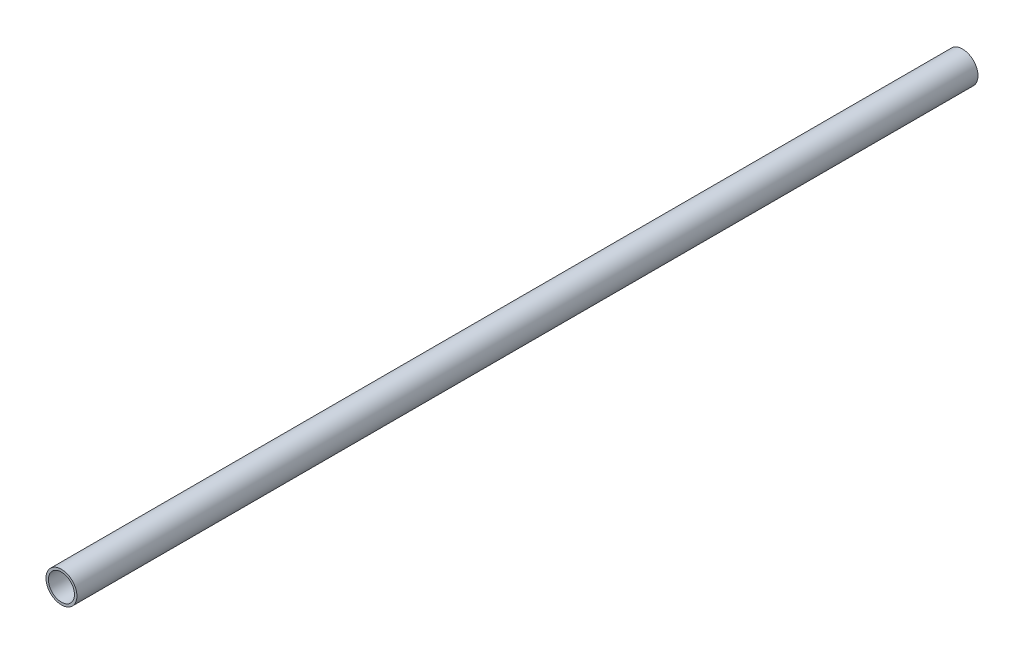
ISO-10303-21;
HEADER;
FILE_DESCRIPTION(('STEP AP214'),'2;1');
FILE_NAME('part.step','',(''),(''),'','','');
FILE_SCHEMA(('AUTOMOTIVE_DESIGN { 1 0 10303 214 1 1 1 1 }'));
ENDSEC;
DATA;
#1=APPLICATION_CONTEXT('core data for automotive mechanical design processes');
#2=APPLICATION_PROTOCOL_DEFINITION('international standard','automotive_design',2000,#1);
#3=PRODUCT_CONTEXT('',#1,'mechanical');
#4=PRODUCT('Part','Part','',(#3));
#5=PRODUCT_RELATED_PRODUCT_CATEGORY('part','',(#4));
#6=PRODUCT_DEFINITION_FORMATION('','',#4);
#7=PRODUCT_DEFINITION_CONTEXT('part definition',#1,'design');
#8=PRODUCT_DEFINITION('design','',#6,#7);
#9=PRODUCT_DEFINITION_SHAPE('','',#8);
#10=(LENGTH_UNIT() NAMED_UNIT(*) SI_UNIT(.MILLI.,.METRE.));
#11=(NAMED_UNIT(*) PLANE_ANGLE_UNIT() SI_UNIT($,.RADIAN.));
#12=(NAMED_UNIT(*) SI_UNIT($,.STERADIAN.) SOLID_ANGLE_UNIT());
#13=UNCERTAINTY_MEASURE_WITH_UNIT(LENGTH_MEASURE(1.E-05),#10,'distance_accuracy_value','');
#14=(GEOMETRIC_REPRESENTATION_CONTEXT(3) GLOBAL_UNCERTAINTY_ASSIGNED_CONTEXT((#13)) GLOBAL_UNIT_ASSIGNED_CONTEXT((#10,
#11,#12)) REPRESENTATION_CONTEXT('',''));
#15=CARTESIAN_POINT('',(0.,0.,0.));
#16=DIRECTION('',(0.,0.,1.));
#17=DIRECTION('',(1.,0.,0.));
#18=AXIS2_PLACEMENT_3D('',#15,#16,#17);
#19=CARTESIAN_POINT('',(0.,0.,370.));
#20=DIRECTION('',(0.,0.,1.));
#21=DIRECTION('',(1.,0.,0.));
#22=AXIS2_PLACEMENT_3D('',#19,#20,#21);
#23=PLANE('',#22);
#24=CARTESIAN_POINT('',(0.,0.,370.));
#25=DIRECTION('',(0.,0.,1.));
#26=DIRECTION('',(1.,0.,0.));
#27=AXIS2_PLACEMENT_3D('',#24,#25,#26);
#28=CIRCLE('',#27,6.35);
#29=CARTESIAN_POINT('',(6.35,0.,370.));
#30=VERTEX_POINT('',#29);
#31=EDGE_CURVE('E10',#30,#30,#28,.T.);
#32=ORIENTED_EDGE('',*,*,#31,.T.);
#33=EDGE_LOOP('',(#32));
#34=FACE_BOUND('',#33,.T.);
#35=CARTESIAN_POINT('',(0.,0.,370.));
#36=DIRECTION('',(0.,0.,1.));
#37=DIRECTION('',(1.,0.,0.));
#38=AXIS2_PLACEMENT_3D('',#35,#36,#37);
#39=CIRCLE('',#38,5.35);
#40=CARTESIAN_POINT('',(5.35,0.,370.));
#41=VERTEX_POINT('',#40);
#42=EDGE_CURVE('E52',#41,#41,#39,.T.);
#43=ORIENTED_EDGE('',*,*,#42,.F.);
#44=EDGE_LOOP('',(#43));
#45=FACE_BOUND('',#44,.T.);
#46=ADVANCED_FACE('F39',(#34,#45),#23,.T.);
#47=CARTESIAN_POINT('',(0.,0.,0.));
#48=DIRECTION('',(0.,0.,1.));
#49=DIRECTION('',(1.,0.,0.));
#50=AXIS2_PLACEMENT_3D('',#47,#48,#49);
#51=PLANE('',#50);
#52=CARTESIAN_POINT('',(0.,0.,0.));
#53=DIRECTION('',(0.,0.,1.));
#54=DIRECTION('',(1.,0.,0.));
#55=AXIS2_PLACEMENT_3D('',#52,#53,#54);
#56=CIRCLE('',#55,6.35);
#57=CARTESIAN_POINT('',(6.35,0.,0.));
#58=VERTEX_POINT('',#57);
#59=EDGE_CURVE('E43',#58,#58,#56,.T.);
#60=ORIENTED_EDGE('',*,*,#59,.F.);
#61=EDGE_LOOP('',(#60));
#62=FACE_BOUND('',#61,.T.);
#63=CARTESIAN_POINT('',(0.,0.,0.));
#64=DIRECTION('',(0.,0.,1.));
#65=DIRECTION('',(1.,0.,0.));
#66=AXIS2_PLACEMENT_3D('',#63,#64,#65);
#67=CIRCLE('',#66,5.35);
#68=CARTESIAN_POINT('',(5.35,0.,0.));
#69=VERTEX_POINT('',#68);
#70=EDGE_CURVE('E54',#69,#69,#67,.T.);
#71=ORIENTED_EDGE('',*,*,#70,.T.);
#72=EDGE_LOOP('',(#71));
#73=FACE_BOUND('',#72,.T.);
#74=ADVANCED_FACE('F66',(#62,#73),#51,.F.);
#75=CARTESIAN_POINT('',(0.,0.,370.));
#76=DIRECTION('',(0.,0.,-1.));
#77=DIRECTION('',(-1.,0.,0.));
#78=AXIS2_PLACEMENT_3D('',#75,#76,#77);
#79=CYLINDRICAL_SURFACE('',#78,6.35);
#80=ORIENTED_EDGE('',*,*,#31,.F.);
#81=EDGE_LOOP('',(#80));
#82=FACE_BOUND('',#81,.T.);
#83=ORIENTED_EDGE('',*,*,#59,.T.);
#84=EDGE_LOOP('',(#83));
#85=FACE_BOUND('',#84,.T.);
#86=ADVANCED_FACE('F41',(#82,#85),#79,.T.);
#87=CARTESIAN_POINT('',(0.,0.,370.));
#88=DIRECTION('',(0.,0.,-1.));
#89=DIRECTION('',(-1.,0.,0.));
#90=AXIS2_PLACEMENT_3D('',#87,#88,#89);
#91=CYLINDRICAL_SURFACE('',#90,5.35);
#92=ORIENTED_EDGE('',*,*,#42,.T.);
#93=EDGE_LOOP('',(#92));
#94=FACE_BOUND('',#93,.T.);
#95=ORIENTED_EDGE('',*,*,#70,.F.);
#96=EDGE_LOOP('',(#95));
#97=FACE_BOUND('',#96,.T.);
#98=ADVANCED_FACE('F62',(#94,#97),#91,.F.);
#99=CLOSED_SHELL('',(#46,#74,#86,#98));
#100=MANIFOLD_SOLID_BREP('B2',#99);
#101=ADVANCED_BREP_SHAPE_REPRESENTATION('',(#18,#100),#14);
#102=SHAPE_DEFINITION_REPRESENTATION(#9,#101);
ENDSEC;
END-ISO-10303-21;
